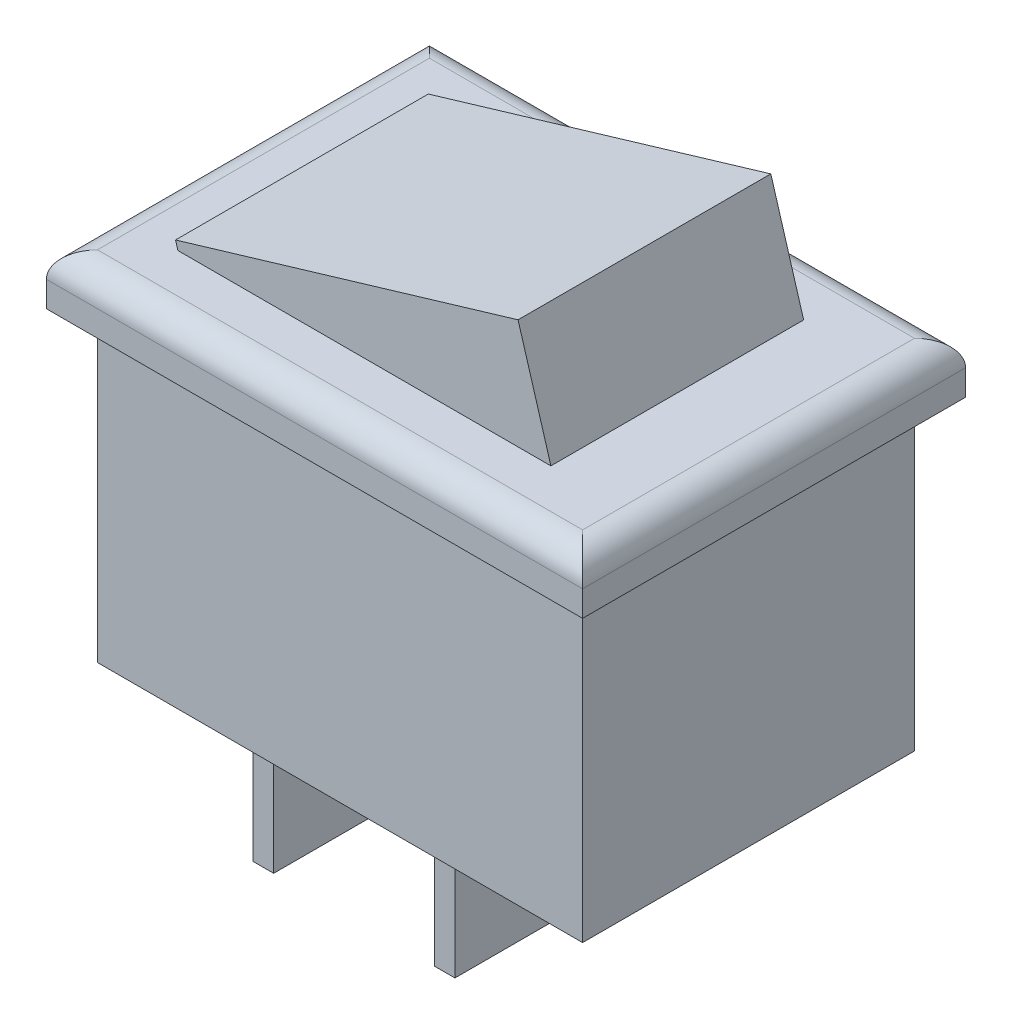
ISO-10303-21;
HEADER;
FILE_DESCRIPTION(('STEP AP214'),'2;1');
FILE_NAME('part.step','',(''),(''),'','','');
FILE_SCHEMA(('AUTOMOTIVE_DESIGN { 1 0 10303 214 1 1 1 1 }'));
ENDSEC;
DATA;
#1=APPLICATION_CONTEXT('core data for automotive mechanical design processes');
#2=APPLICATION_PROTOCOL_DEFINITION('international standard','automotive_design',2000,#1);
#3=PRODUCT_CONTEXT('',#1,'mechanical');
#4=PRODUCT('Part','Part','',(#3));
#5=PRODUCT_RELATED_PRODUCT_CATEGORY('part','',(#4));
#6=PRODUCT_DEFINITION_FORMATION('','',#4);
#7=PRODUCT_DEFINITION_CONTEXT('part definition',#1,'design');
#8=PRODUCT_DEFINITION('design','',#6,#7);
#9=PRODUCT_DEFINITION_SHAPE('','',#8);
#10=(LENGTH_UNIT() NAMED_UNIT(*) SI_UNIT(.MILLI.,.METRE.));
#11=(NAMED_UNIT(*) PLANE_ANGLE_UNIT() SI_UNIT($,.RADIAN.));
#12=(NAMED_UNIT(*) SI_UNIT($,.STERADIAN.) SOLID_ANGLE_UNIT());
#13=UNCERTAINTY_MEASURE_WITH_UNIT(LENGTH_MEASURE(1.E-05),#10,'distance_accuracy_value','');
#14=(GEOMETRIC_REPRESENTATION_CONTEXT(3) GLOBAL_UNCERTAINTY_ASSIGNED_CONTEXT((#13)) GLOBAL_UNIT_ASSIGNED_CONTEXT((#10,
#11,#12)) REPRESENTATION_CONTEXT('',''));
#15=CARTESIAN_POINT('',(0.,0.,0.));
#16=DIRECTION('',(0.,0.,1.));
#17=DIRECTION('',(1.,0.,0.));
#18=AXIS2_PLACEMENT_3D('',#15,#16,#17);
#19=CARTESIAN_POINT('',(0.4,-19.8,2.4));
#20=DIRECTION('',(-1.,0.,0.));
#21=DIRECTION('',(0.,0.,1.));
#22=AXIS2_PLACEMENT_3D('',#19,#20,#21);
#23=PLANE('',#22);
#24=DIRECTION('',(0.,0.,1.));
#25=VECTOR('',#24,1.);
#26=CARTESIAN_POINT('',(0.4,-12.,2.4));
#27=LINE('',#26,#25);
#28=CARTESIAN_POINT('',(0.4,-12.,-2.4));
#29=VERTEX_POINT('',#28);
#30=CARTESIAN_POINT('',(0.4,-12.,2.4));
#31=VERTEX_POINT('',#30);
#32=EDGE_CURVE('E108',#29,#31,#27,.T.);
#33=ORIENTED_EDGE('',*,*,#32,.T.);
#34=DIRECTION('',(0.,1.,0.));
#35=VECTOR('',#34,1.);
#36=CARTESIAN_POINT('',(0.4,-19.8,2.4));
#37=LINE('',#36,#35);
#38=CARTESIAN_POINT('',(0.4,-19.8,2.4));
#39=VERTEX_POINT('',#38);
#40=EDGE_CURVE('E12',#39,#31,#37,.T.);
#41=ORIENTED_EDGE('',*,*,#40,.F.);
#42=DIRECTION('',(0.,0.,1.));
#43=VECTOR('',#42,1.);
#44=CARTESIAN_POINT('',(0.4,-19.8,2.4));
#45=LINE('',#44,#43);
#46=CARTESIAN_POINT('',(0.4,-19.8,-2.4));
#47=VERTEX_POINT('',#46);
#48=EDGE_CURVE('E96',#47,#39,#45,.T.);
#49=ORIENTED_EDGE('',*,*,#48,.F.);
#50=DIRECTION('',(0.,1.,0.));
#51=VECTOR('',#50,1.);
#52=CARTESIAN_POINT('',(0.4,-19.8,-2.4));
#53=LINE('',#52,#51);
#54=EDGE_CURVE('E104',#47,#29,#53,.T.);
#55=ORIENTED_EDGE('',*,*,#54,.T.);
#56=EDGE_LOOP('',(#33,#41,#49,#55));
#57=FACE_BOUND('',#56,.T.);
#58=ADVANCED_FACE('F45',(#57),#23,.F.);
#59=CARTESIAN_POINT('',(0.4,-19.8,2.4));
#60=DIRECTION('',(0.,0.,-1.));
#61=DIRECTION('',(-1.,0.,0.));
#62=AXIS2_PLACEMENT_3D('',#59,#60,#61);
#63=PLANE('',#62);
#64=DIRECTION('',(-1.,0.,0.));
#65=VECTOR('',#64,1.);
#66=CARTESIAN_POINT('',(0.4,-12.,2.4));
#67=LINE('',#66,#65);
#68=CARTESIAN_POINT('',(-0.400000000000001,-12.,2.4));
#69=VERTEX_POINT('',#68);
#70=EDGE_CURVE('E100',#31,#69,#67,.T.);
#71=ORIENTED_EDGE('',*,*,#70,.T.);
#72=DIRECTION('',(0.,1.,0.));
#73=VECTOR('',#72,1.);
#74=CARTESIAN_POINT('',(-0.400000000000001,-19.8,2.4));
#75=LINE('',#74,#73);
#76=CARTESIAN_POINT('',(-0.400000000000001,-19.8,2.4));
#77=VERTEX_POINT('',#76);
#78=EDGE_CURVE('E53',#77,#69,#75,.T.);
#79=ORIENTED_EDGE('',*,*,#78,.F.);
#80=DIRECTION('',(-1.,0.,0.));
#81=VECTOR('',#80,1.);
#82=CARTESIAN_POINT('',(0.4,-19.8,2.4));
#83=LINE('',#82,#81);
#84=EDGE_CURVE('E91',#39,#77,#83,.T.);
#85=ORIENTED_EDGE('',*,*,#84,.F.);
#86=ORIENTED_EDGE('',*,*,#40,.T.);
#87=EDGE_LOOP('',(#71,#79,#85,#86));
#88=FACE_BOUND('',#87,.T.);
#89=ADVANCED_FACE('F99',(#88),#63,.F.);
#90=CARTESIAN_POINT('',(-0.400000000000001,-19.8,2.4));
#91=DIRECTION('',(1.,0.,0.));
#92=DIRECTION('',(0.,0.,-1.));
#93=AXIS2_PLACEMENT_3D('',#90,#91,#92);
#94=PLANE('',#93);
#95=DIRECTION('',(0.,0.,-1.));
#96=VECTOR('',#95,1.);
#97=CARTESIAN_POINT('',(-0.400000000000001,-12.,2.4));
#98=LINE('',#97,#96);
#99=CARTESIAN_POINT('',(-0.400000000000002,-12.,-2.4));
#100=VERTEX_POINT('',#99);
#101=EDGE_CURVE('E78',#69,#100,#98,.T.);
#102=ORIENTED_EDGE('',*,*,#101,.T.);
#103=DIRECTION('',(0.,1.,0.));
#104=VECTOR('',#103,1.);
#105=CARTESIAN_POINT('',(-0.400000000000002,-19.8,-2.4));
#106=LINE('',#105,#104);
#107=CARTESIAN_POINT('',(-0.400000000000002,-19.8,-2.4));
#108=VERTEX_POINT('',#107);
#109=EDGE_CURVE('E101',#108,#100,#106,.T.);
#110=ORIENTED_EDGE('',*,*,#109,.F.);
#111=DIRECTION('',(0.,0.,-1.));
#112=VECTOR('',#111,1.);
#113=CARTESIAN_POINT('',(-0.400000000000001,-19.8,2.4));
#114=LINE('',#113,#112);
#115=EDGE_CURVE('E94',#77,#108,#114,.T.);
#116=ORIENTED_EDGE('',*,*,#115,.F.);
#117=ORIENTED_EDGE('',*,*,#78,.T.);
#118=EDGE_LOOP('',(#102,#110,#116,#117));
#119=FACE_BOUND('',#118,.T.);
#120=ADVANCED_FACE('F102',(#119),#94,.F.);
#121=CARTESIAN_POINT('',(0.4,-19.8,-2.4));
#122=DIRECTION('',(0.,0.,1.));
#123=DIRECTION('',(1.,0.,0.));
#124=AXIS2_PLACEMENT_3D('',#121,#122,#123);
#125=PLANE('',#124);
#126=DIRECTION('',(1.,0.,0.));
#127=VECTOR('',#126,1.);
#128=CARTESIAN_POINT('',(0.4,-12.,-2.4));
#129=LINE('',#128,#127);
#130=EDGE_CURVE('E84',#100,#29,#129,.T.);
#131=ORIENTED_EDGE('',*,*,#130,.T.);
#132=ORIENTED_EDGE('',*,*,#54,.F.);
#133=DIRECTION('',(1.,0.,0.));
#134=VECTOR('',#133,1.);
#135=CARTESIAN_POINT('',(0.4,-19.8,-2.4));
#136=LINE('',#135,#134);
#137=EDGE_CURVE('E61',#108,#47,#136,.T.);
#138=ORIENTED_EDGE('',*,*,#137,.F.);
#139=ORIENTED_EDGE('',*,*,#109,.T.);
#140=EDGE_LOOP('',(#131,#132,#138,#139));
#141=FACE_BOUND('',#140,.T.);
#142=ADVANCED_FACE('F115',(#141),#125,.F.);
#143=CARTESIAN_POINT('',(0.,-19.8,0.));
#144=DIRECTION('',(0.,1.,0.));
#145=DIRECTION('',(0.,0.,1.));
#146=AXIS2_PLACEMENT_3D('',#143,#144,#145);
#147=PLANE('',#146);
#148=ORIENTED_EDGE('',*,*,#48,.T.);
#149=ORIENTED_EDGE('',*,*,#84,.T.);
#150=ORIENTED_EDGE('',*,*,#115,.T.);
#151=ORIENTED_EDGE('',*,*,#137,.T.);
#152=EDGE_LOOP('',(#148,#149,#150,#151));
#153=FACE_BOUND('',#152,.T.);
#154=ADVANCED_FACE('F92',(#153),#147,.F.);
#155=CARTESIAN_POINT('',(0.,-12.,0.));
#156=DIRECTION('',(0.,1.,0.));
#157=DIRECTION('',(0.,0.,1.));
#158=AXIS2_PLACEMENT_3D('',#155,#156,#157);
#159=PLANE('',#158);
#160=ORIENTED_EDGE('',*,*,#32,.F.);
#161=ORIENTED_EDGE('',*,*,#130,.F.);
#162=ORIENTED_EDGE('',*,*,#101,.F.);
#163=ORIENTED_EDGE('',*,*,#70,.F.);
#164=EDGE_LOOP('',(#160,#161,#162,#163));
#165=FACE_BOUND('',#164,.T.);
#166=ADVANCED_FACE('F118',(#165),#159,.T.);
#167=CLOSED_SHELL('',(#58,#89,#120,#142,#154,#166));
#168=MANIFOLD_SOLID_BREP('B2',#167);
#169=CARTESIAN_POINT('',(-7.5,-19.8,2.4));
#170=DIRECTION('',(1.,0.,0.));
#171=DIRECTION('',(0.,0.,-1.));
#172=AXIS2_PLACEMENT_3D('',#169,#170,#171);
#173=PLANE('',#172);
#174=DIRECTION('',(0.,0.,-1.));
#175=VECTOR('',#174,1.);
#176=CARTESIAN_POINT('',(-7.5,-12.,2.4));
#177=LINE('',#176,#175);
#178=CARTESIAN_POINT('',(-7.5,-12.,2.4));
#179=VERTEX_POINT('',#178);
#180=CARTESIAN_POINT('',(-7.5,-12.,-2.4));
#181=VERTEX_POINT('',#180);
#182=EDGE_CURVE('E240',#179,#181,#177,.T.);
#183=ORIENTED_EDGE('',*,*,#182,.T.);
#184=DIRECTION('',(0.,1.,0.));
#185=VECTOR('',#184,1.);
#186=CARTESIAN_POINT('',(-7.5,-19.8,-2.4));
#187=LINE('',#186,#185);
#188=CARTESIAN_POINT('',(-7.5,-19.8,-2.4));
#189=VERTEX_POINT('',#188);
#190=EDGE_CURVE('E43',#189,#181,#187,.T.);
#191=ORIENTED_EDGE('',*,*,#190,.F.);
#192=DIRECTION('',(0.,0.,-1.));
#193=VECTOR('',#192,1.);
#194=CARTESIAN_POINT('',(-7.5,-19.8,2.4));
#195=LINE('',#194,#193);
#196=CARTESIAN_POINT('',(-7.5,-19.8,2.4));
#197=VERTEX_POINT('',#196);
#198=EDGE_CURVE('E228',#197,#189,#195,.T.);
#199=ORIENTED_EDGE('',*,*,#198,.F.);
#200=DIRECTION('',(0.,1.,0.));
#201=VECTOR('',#200,1.);
#202=CARTESIAN_POINT('',(-7.5,-19.8,2.4));
#203=LINE('',#202,#201);
#204=EDGE_CURVE('E236',#197,#179,#203,.T.);
#205=ORIENTED_EDGE('',*,*,#204,.T.);
#206=EDGE_LOOP('',(#183,#191,#199,#205));
#207=FACE_BOUND('',#206,.T.);
#208=ADVANCED_FACE('F177',(#207),#173,.F.);
#209=CARTESIAN_POINT('',(-7.5,-19.8,-2.4));
#210=DIRECTION('',(0.,0.,1.));
#211=DIRECTION('',(1.,0.,0.));
#212=AXIS2_PLACEMENT_3D('',#209,#210,#211);
#213=PLANE('',#212);
#214=DIRECTION('',(1.,0.,0.));
#215=VECTOR('',#214,1.);
#216=CARTESIAN_POINT('',(-7.5,-12.,-2.4));
#217=LINE('',#216,#215);
#218=CARTESIAN_POINT('',(-6.7,-12.,-2.4));
#219=VERTEX_POINT('',#218);
#220=EDGE_CURVE('E232',#181,#219,#217,.T.);
#221=ORIENTED_EDGE('',*,*,#220,.T.);
#222=DIRECTION('',(0.,1.,0.));
#223=VECTOR('',#222,1.);
#224=CARTESIAN_POINT('',(-6.7,-19.8,-2.4));
#225=LINE('',#224,#223);
#226=CARTESIAN_POINT('',(-6.7,-19.8,-2.4));
#227=VERTEX_POINT('',#226);
#228=EDGE_CURVE('E185',#227,#219,#225,.T.);
#229=ORIENTED_EDGE('',*,*,#228,.F.);
#230=DIRECTION('',(1.,0.,0.));
#231=VECTOR('',#230,1.);
#232=CARTESIAN_POINT('',(-7.5,-19.8,-2.4));
#233=LINE('',#232,#231);
#234=EDGE_CURVE('E223',#189,#227,#233,.T.);
#235=ORIENTED_EDGE('',*,*,#234,.F.);
#236=ORIENTED_EDGE('',*,*,#190,.T.);
#237=EDGE_LOOP('',(#221,#229,#235,#236));
#238=FACE_BOUND('',#237,.T.);
#239=ADVANCED_FACE('F231',(#238),#213,.F.);
#240=CARTESIAN_POINT('',(-6.7,-19.8,2.4));
#241=DIRECTION('',(-1.,0.,0.));
#242=DIRECTION('',(0.,0.,1.));
#243=AXIS2_PLACEMENT_3D('',#240,#241,#242);
#244=PLANE('',#243);
#245=DIRECTION('',(0.,0.,1.));
#246=VECTOR('',#245,1.);
#247=CARTESIAN_POINT('',(-6.7,-12.,2.4));
#248=LINE('',#247,#246);
#249=CARTESIAN_POINT('',(-6.7,-12.,2.4));
#250=VERTEX_POINT('',#249);
#251=EDGE_CURVE('E210',#219,#250,#248,.T.);
#252=ORIENTED_EDGE('',*,*,#251,.T.);
#253=DIRECTION('',(0.,1.,0.));
#254=VECTOR('',#253,1.);
#255=CARTESIAN_POINT('',(-6.7,-19.8,2.4));
#256=LINE('',#255,#254);
#257=CARTESIAN_POINT('',(-6.7,-19.8,2.4));
#258=VERTEX_POINT('',#257);
#259=EDGE_CURVE('E233',#258,#250,#256,.T.);
#260=ORIENTED_EDGE('',*,*,#259,.F.);
#261=DIRECTION('',(0.,0.,1.));
#262=VECTOR('',#261,1.);
#263=CARTESIAN_POINT('',(-6.7,-19.8,2.4));
#264=LINE('',#263,#262);
#265=EDGE_CURVE('E226',#227,#258,#264,.T.);
#266=ORIENTED_EDGE('',*,*,#265,.F.);
#267=ORIENTED_EDGE('',*,*,#228,.T.);
#268=EDGE_LOOP('',(#252,#260,#266,#267));
#269=FACE_BOUND('',#268,.T.);
#270=ADVANCED_FACE('F234',(#269),#244,.F.);
#271=CARTESIAN_POINT('',(-7.5,-19.8,2.4));
#272=DIRECTION('',(0.,0.,-1.));
#273=DIRECTION('',(-1.,0.,0.));
#274=AXIS2_PLACEMENT_3D('',#271,#272,#273);
#275=PLANE('',#274);
#276=DIRECTION('',(-1.,0.,0.));
#277=VECTOR('',#276,1.);
#278=CARTESIAN_POINT('',(-7.5,-12.,2.4));
#279=LINE('',#278,#277);
#280=EDGE_CURVE('E216',#250,#179,#279,.T.);
#281=ORIENTED_EDGE('',*,*,#280,.T.);
#282=ORIENTED_EDGE('',*,*,#204,.F.);
#283=DIRECTION('',(-1.,0.,0.));
#284=VECTOR('',#283,1.);
#285=CARTESIAN_POINT('',(-7.5,-19.8,2.4));
#286=LINE('',#285,#284);
#287=EDGE_CURVE('E193',#258,#197,#286,.T.);
#288=ORIENTED_EDGE('',*,*,#287,.F.);
#289=ORIENTED_EDGE('',*,*,#259,.T.);
#290=EDGE_LOOP('',(#281,#282,#288,#289));
#291=FACE_BOUND('',#290,.T.);
#292=ADVANCED_FACE('F247',(#291),#275,.F.);
#293=CARTESIAN_POINT('',(0.,-19.8,0.));
#294=DIRECTION('',(0.,-1.,0.));
#295=DIRECTION('',(0.,0.,-1.));
#296=AXIS2_PLACEMENT_3D('',#293,#294,#295);
#297=PLANE('',#296);
#298=ORIENTED_EDGE('',*,*,#198,.T.);
#299=ORIENTED_EDGE('',*,*,#234,.T.);
#300=ORIENTED_EDGE('',*,*,#265,.T.);
#301=ORIENTED_EDGE('',*,*,#287,.T.);
#302=EDGE_LOOP('',(#298,#299,#300,#301));
#303=FACE_BOUND('',#302,.T.);
#304=ADVANCED_FACE('F224',(#303),#297,.T.);
#305=CARTESIAN_POINT('',(0.,-12.,0.));
#306=DIRECTION('',(0.,-1.,0.));
#307=DIRECTION('',(0.,0.,-1.));
#308=AXIS2_PLACEMENT_3D('',#305,#306,#307);
#309=PLANE('',#308);
#310=ORIENTED_EDGE('',*,*,#182,.F.);
#311=ORIENTED_EDGE('',*,*,#280,.F.);
#312=ORIENTED_EDGE('',*,*,#251,.F.);
#313=ORIENTED_EDGE('',*,*,#220,.F.);
#314=EDGE_LOOP('',(#310,#311,#312,#313));
#315=FACE_BOUND('',#314,.T.);
#316=ADVANCED_FACE('F250',(#315),#309,.F.);
#317=CLOSED_SHELL('',(#208,#239,#270,#292,#304,#316));
#318=MANIFOLD_SOLID_BREP('B6',#317);
#319=CARTESIAN_POINT('',(0.,2.,0.));
#320=DIRECTION('',(0.,-1.,0.));
#321=DIRECTION('',(0.,0.,-1.));
#322=AXIS2_PLACEMENT_3D('',#319,#320,#321);
#323=PLANE('',#322);
#324=DIRECTION('',(0.,0.,1.));
#325=VECTOR('',#324,1.);
#326=CARTESIAN_POINT('',(-9.5,2.,0.));
#327=LINE('',#326,#325);
#328=CARTESIAN_POINT('',(-9.5,2.,-6.5));
#329=VERTEX_POINT('',#328);
#330=CARTESIAN_POINT('',(-9.5,2.,6.5));
#331=VERTEX_POINT('',#330);
#332=EDGE_CURVE('E493',#329,#331,#327,.T.);
#333=ORIENTED_EDGE('',*,*,#332,.T.);
#334=DIRECTION('',(1.,0.,0.));
#335=VECTOR('',#334,1.);
#336=CARTESIAN_POINT('',(0.,2.,6.5));
#337=LINE('',#336,#335);
#338=CARTESIAN_POINT('',(9.5,2.,6.5));
#339=VERTEX_POINT('',#338);
#340=EDGE_CURVE('E495',#331,#339,#337,.T.);
#341=ORIENTED_EDGE('',*,*,#340,.T.);
#342=DIRECTION('',(0.,0.,-1.));
#343=VECTOR('',#342,1.);
#344=CARTESIAN_POINT('',(9.5,2.,0.));
#345=LINE('',#344,#343);
#346=CARTESIAN_POINT('',(9.5,2.,-6.5));
#347=VERTEX_POINT('',#346);
#348=EDGE_CURVE('E489',#339,#347,#345,.T.);
#349=ORIENTED_EDGE('',*,*,#348,.T.);
#350=DIRECTION('',(-1.,0.,0.));
#351=VECTOR('',#350,1.);
#352=CARTESIAN_POINT('',(0.,2.,-6.5));
#353=LINE('',#352,#351);
#354=EDGE_CURVE('E491',#347,#329,#353,.T.);
#355=ORIENTED_EDGE('',*,*,#354,.T.);
#356=EDGE_LOOP('',(#333,#341,#349,#355));
#357=FACE_BOUND('',#356,.T.);
#358=DIRECTION('',(1.,0.,0.));
#359=VECTOR('',#358,1.);
#360=CARTESIAN_POINT('',(0.,2.,4.95));
#361=LINE('',#360,#359);
#362=CARTESIAN_POINT('',(-7.90077352049926,2.,4.95));
#363=VERTEX_POINT('',#362);
#364=CARTESIAN_POINT('',(6.70820393249937,2.,4.95));
#365=VERTEX_POINT('',#364);
#366=EDGE_CURVE('E175',#363,#365,#361,.T.);
#367=ORIENTED_EDGE('',*,*,#366,.F.);
#368=DIRECTION('',(0.,0.,1.));
#369=VECTOR('',#368,1.);
#370=CARTESIAN_POINT('',(-7.90077352049926,2.,0.));
#371=LINE('',#370,#369);
#372=CARTESIAN_POINT('',(-7.90077352049926,2.,-4.95));
#373=VERTEX_POINT('',#372);
#374=EDGE_CURVE('E308',#373,#363,#371,.T.);
#375=ORIENTED_EDGE('',*,*,#374,.F.);
#376=DIRECTION('',(1.,0.,0.));
#377=VECTOR('',#376,1.);
#378=CARTESIAN_POINT('',(0.,2.,-4.95));
#379=LINE('',#378,#377);
#380=CARTESIAN_POINT('',(6.70820393249937,2.,-4.95));
#381=VERTEX_POINT('',#380);
#382=EDGE_CURVE('E505',#373,#381,#379,.T.);
#383=ORIENTED_EDGE('',*,*,#382,.T.);
#384=DIRECTION('',(0.,0.,-1.));
#385=VECTOR('',#384,1.);
#386=CARTESIAN_POINT('',(6.70820393249937,2.,4.95));
#387=LINE('',#386,#385);
#388=EDGE_CURVE('E424',#365,#381,#387,.T.);
#389=ORIENTED_EDGE('',*,*,#388,.F.);
#390=EDGE_LOOP('',(#367,#375,#383,#389));
#391=FACE_BOUND('',#390,.T.);
#392=ADVANCED_FACE('F300',(#357,#391),#323,.F.);
#393=CARTESIAN_POINT('',(10.5,2.,7.5));
#394=DIRECTION('',(-1.,0.,0.));
#395=DIRECTION('',(0.,0.,1.));
#396=AXIS2_PLACEMENT_3D('',#393,#394,#395);
#397=PLANE('',#396);
#398=DIRECTION('',(0.,-1.,0.));
#399=VECTOR('',#398,1.);
#400=CARTESIAN_POINT('',(10.5,2.,-7.5));
#401=LINE('',#400,#399);
#402=CARTESIAN_POINT('',(10.5,1.,-7.5));
#403=VERTEX_POINT('',#402);
#404=CARTESIAN_POINT('',(10.5,0.,-7.5));
#405=VERTEX_POINT('',#404);
#406=EDGE_CURVE('E475',#403,#405,#401,.T.);
#407=ORIENTED_EDGE('',*,*,#406,.F.);
#408=DIRECTION('',(0.,0.,-1.));
#409=VECTOR('',#408,1.);
#410=CARTESIAN_POINT('',(10.5,1.,7.5));
#411=LINE('',#410,#409);
#412=CARTESIAN_POINT('',(10.5,1.,7.5));
#413=VERTEX_POINT('',#412);
#414=EDGE_CURVE('E504',#403,#413,#411,.F.);
#415=ORIENTED_EDGE('',*,*,#414,.T.);
#416=DIRECTION('',(0.,-1.,0.));
#417=VECTOR('',#416,1.);
#418=CARTESIAN_POINT('',(10.5,2.,7.5));
#419=LINE('',#418,#417);
#420=CARTESIAN_POINT('',(10.5,0.,7.5));
#421=VERTEX_POINT('',#420);
#422=EDGE_CURVE('E469',#413,#421,#419,.T.);
#423=ORIENTED_EDGE('',*,*,#422,.T.);
#424=DIRECTION('',(0.,0.,-1.));
#425=VECTOR('',#424,1.);
#426=CARTESIAN_POINT('',(10.5,0.,7.5));
#427=LINE('',#426,#425);
#428=EDGE_CURVE('E449',#421,#405,#427,.T.);
#429=ORIENTED_EDGE('',*,*,#428,.T.);
#430=EDGE_LOOP('',(#407,#415,#423,#429));
#431=FACE_BOUND('',#430,.T.);
#432=ADVANCED_FACE('F533',(#431),#397,.F.);
#433=CARTESIAN_POINT('',(-10.5,2.,-7.5));
#434=DIRECTION('',(0.,0.,1.));
#435=DIRECTION('',(1.,0.,0.));
#436=AXIS2_PLACEMENT_3D('',#433,#434,#435);
#437=PLANE('',#436);
#438=DIRECTION('',(0.,-1.,0.));
#439=VECTOR('',#438,1.);
#440=CARTESIAN_POINT('',(-10.5,2.,-7.5));
#441=LINE('',#440,#439);
#442=CARTESIAN_POINT('',(-10.5,1.,-7.5));
#443=VERTEX_POINT('',#442);
#444=CARTESIAN_POINT('',(-10.5,0.,-7.5));
#445=VERTEX_POINT('',#444);
#446=EDGE_CURVE('E473',#443,#445,#441,.T.);
#447=ORIENTED_EDGE('',*,*,#446,.F.);
#448=DIRECTION('',(-1.,0.,0.));
#449=VECTOR('',#448,1.);
#450=CARTESIAN_POINT('',(-10.5,1.,-7.5));
#451=LINE('',#450,#449);
#452=EDGE_CURVE('E323',#443,#403,#451,.F.);
#453=ORIENTED_EDGE('',*,*,#452,.T.);
#454=ORIENTED_EDGE('',*,*,#406,.T.);
#455=DIRECTION('',(-1.,0.,0.));
#456=VECTOR('',#455,1.);
#457=CARTESIAN_POINT('',(-10.5,0.,-7.5));
#458=LINE('',#457,#456);
#459=EDGE_CURVE('E460',#405,#445,#458,.T.);
#460=ORIENTED_EDGE('',*,*,#459,.T.);
#461=EDGE_LOOP('',(#447,#453,#454,#460));
#462=FACE_BOUND('',#461,.T.);
#463=ADVANCED_FACE('F539',(#462),#437,.F.);
#464=CARTESIAN_POINT('',(-10.5,2.,7.5));
#465=DIRECTION('',(1.,0.,0.));
#466=DIRECTION('',(0.,0.,-1.));
#467=AXIS2_PLACEMENT_3D('',#464,#465,#466);
#468=PLANE('',#467);
#469=DIRECTION('',(0.,-1.,0.));
#470=VECTOR('',#469,1.);
#471=CARTESIAN_POINT('',(-10.5,2.,7.5));
#472=LINE('',#471,#470);
#473=CARTESIAN_POINT('',(-10.5,1.,7.5));
#474=VERTEX_POINT('',#473);
#475=CARTESIAN_POINT('',(-10.5,0.,7.5));
#476=VERTEX_POINT('',#475);
#477=EDGE_CURVE('E471',#474,#476,#472,.T.);
#478=ORIENTED_EDGE('',*,*,#477,.F.);
#479=DIRECTION('',(0.,0.,1.));
#480=VECTOR('',#479,1.);
#481=CARTESIAN_POINT('',(-10.5,1.,7.5));
#482=LINE('',#481,#480);
#483=EDGE_CURVE('E501',#474,#443,#482,.F.);
#484=ORIENTED_EDGE('',*,*,#483,.T.);
#485=ORIENTED_EDGE('',*,*,#446,.T.);
#486=DIRECTION('',(0.,0.,1.));
#487=VECTOR('',#486,1.);
#488=CARTESIAN_POINT('',(-10.5,0.,7.5));
#489=LINE('',#488,#487);
#490=EDGE_CURVE('E463',#445,#476,#489,.T.);
#491=ORIENTED_EDGE('',*,*,#490,.T.);
#492=EDGE_LOOP('',(#478,#484,#485,#491));
#493=FACE_BOUND('',#492,.T.);
#494=ADVANCED_FACE('F553',(#493),#468,.F.);
#495=CARTESIAN_POINT('',(-10.5,2.,7.5));
#496=DIRECTION('',(0.,0.,-1.));
#497=DIRECTION('',(-1.,0.,0.));
#498=AXIS2_PLACEMENT_3D('',#495,#496,#497);
#499=PLANE('',#498);
#500=ORIENTED_EDGE('',*,*,#422,.F.);
#501=DIRECTION('',(1.,0.,0.));
#502=VECTOR('',#501,1.);
#503=CARTESIAN_POINT('',(-10.5,1.,7.5));
#504=LINE('',#503,#502);
#505=EDGE_CURVE('E498',#413,#474,#504,.F.);
#506=ORIENTED_EDGE('',*,*,#505,.T.);
#507=ORIENTED_EDGE('',*,*,#477,.T.);
#508=DIRECTION('',(1.,0.,0.));
#509=VECTOR('',#508,1.);
#510=CARTESIAN_POINT('',(-10.5,0.,7.5));
#511=LINE('',#510,#509);
#512=EDGE_CURVE('E466',#476,#421,#511,.T.);
#513=ORIENTED_EDGE('',*,*,#512,.T.);
#514=EDGE_LOOP('',(#500,#506,#507,#513));
#515=FACE_BOUND('',#514,.T.);
#516=ADVANCED_FACE('F549',(#515),#499,.F.);
#517=CARTESIAN_POINT('',(0.,0.,0.));
#518=DIRECTION('',(0.,-1.,0.));
#519=DIRECTION('',(0.,0.,-1.));
#520=AXIS2_PLACEMENT_3D('',#517,#518,#519);
#521=PLANE('',#520);
#522=DIRECTION('',(0.,0.,1.));
#523=VECTOR('',#522,1.);
#524=CARTESIAN_POINT('',(9.5,0.,0.));
#525=LINE('',#524,#523);
#526=CARTESIAN_POINT('',(9.5,0.,-6.5));
#527=VERTEX_POINT('',#526);
#528=CARTESIAN_POINT('',(9.5,0.,6.5));
#529=VERTEX_POINT('',#528);
#530=EDGE_CURVE('E486',#527,#529,#525,.T.);
#531=ORIENTED_EDGE('',*,*,#530,.F.);
#532=DIRECTION('',(1.,0.,0.));
#533=VECTOR('',#532,1.);
#534=CARTESIAN_POINT('',(0.,0.,-6.5));
#535=LINE('',#534,#533);
#536=CARTESIAN_POINT('',(-9.5,0.,-6.5));
#537=VERTEX_POINT('',#536);
#538=EDGE_CURVE('E477',#537,#527,#535,.T.);
#539=ORIENTED_EDGE('',*,*,#538,.F.);
#540=DIRECTION('',(0.,0.,-1.));
#541=VECTOR('',#540,1.);
#542=CARTESIAN_POINT('',(-9.5,0.,0.));
#543=LINE('',#542,#541);
#544=CARTESIAN_POINT('',(-9.5,0.,6.5));
#545=VERTEX_POINT('',#544);
#546=EDGE_CURVE('E480',#545,#537,#543,.T.);
#547=ORIENTED_EDGE('',*,*,#546,.F.);
#548=DIRECTION('',(-1.,0.,0.));
#549=VECTOR('',#548,1.);
#550=CARTESIAN_POINT('',(0.,0.,6.5));
#551=LINE('',#550,#549);
#552=EDGE_CURVE('E483',#529,#545,#551,.T.);
#553=ORIENTED_EDGE('',*,*,#552,.F.);
#554=EDGE_LOOP('',(#531,#539,#547,#553));
#555=FACE_BOUND('',#554,.T.);
#556=ORIENTED_EDGE('',*,*,#428,.F.);
#557=ORIENTED_EDGE('',*,*,#512,.F.);
#558=ORIENTED_EDGE('',*,*,#490,.F.);
#559=ORIENTED_EDGE('',*,*,#459,.F.);
#560=EDGE_LOOP('',(#556,#557,#558,#559));
#561=FACE_BOUND('',#560,.T.);
#562=ADVANCED_FACE('F546',(#555,#561),#521,.T.);
#563=CARTESIAN_POINT('',(9.5,-12.,6.5));
#564=DIRECTION('',(1.,0.,0.));
#565=DIRECTION('',(0.,0.,-1.));
#566=AXIS2_PLACEMENT_3D('',#563,#564,#565);
#567=PLANE('',#566);
#568=DIRECTION('',(0.,1.,0.));
#569=VECTOR('',#568,1.);
#570=CARTESIAN_POINT('',(9.5,-12.,-6.5));
#571=LINE('',#570,#569);
#572=CARTESIAN_POINT('',(9.5,-12.,-6.5));
#573=VERTEX_POINT('',#572);
#574=EDGE_CURVE('E445',#573,#527,#571,.T.);
#575=ORIENTED_EDGE('',*,*,#574,.T.);
#576=ORIENTED_EDGE('',*,*,#530,.T.);
#577=DIRECTION('',(0.,1.,0.));
#578=VECTOR('',#577,1.);
#579=CARTESIAN_POINT('',(9.5,-12.,6.5));
#580=LINE('',#579,#578);
#581=CARTESIAN_POINT('',(9.5,-12.,6.5));
#582=VERTEX_POINT('',#581);
#583=EDGE_CURVE('E446',#582,#529,#580,.T.);
#584=ORIENTED_EDGE('',*,*,#583,.F.);
#585=DIRECTION('',(0.,0.,-1.));
#586=VECTOR('',#585,1.);
#587=CARTESIAN_POINT('',(9.5,-12.,6.5));
#588=LINE('',#587,#586);
#589=EDGE_CURVE('E432',#582,#573,#588,.T.);
#590=ORIENTED_EDGE('',*,*,#589,.T.);
#591=EDGE_LOOP('',(#575,#576,#584,#590));
#592=FACE_BOUND('',#591,.T.);
#593=ADVANCED_FACE('F544',(#592),#567,.T.);
#594=CARTESIAN_POINT('',(-9.5,-12.,6.5));
#595=DIRECTION('',(0.,0.,1.));
#596=DIRECTION('',(1.,0.,0.));
#597=AXIS2_PLACEMENT_3D('',#594,#595,#596);
#598=PLANE('',#597);
#599=ORIENTED_EDGE('',*,*,#583,.T.);
#600=ORIENTED_EDGE('',*,*,#552,.T.);
#601=DIRECTION('',(0.,1.,0.));
#602=VECTOR('',#601,1.);
#603=CARTESIAN_POINT('',(-9.5,-12.,6.5));
#604=LINE('',#603,#602);
#605=CARTESIAN_POINT('',(-9.5,-12.,6.5));
#606=VERTEX_POINT('',#605);
#607=EDGE_CURVE('E450',#606,#545,#604,.T.);
#608=ORIENTED_EDGE('',*,*,#607,.F.);
#609=DIRECTION('',(1.,0.,0.));
#610=VECTOR('',#609,1.);
#611=CARTESIAN_POINT('',(-9.5,-12.,6.5));
#612=LINE('',#611,#610);
#613=EDGE_CURVE('E442',#606,#582,#612,.T.);
#614=ORIENTED_EDGE('',*,*,#613,.T.);
#615=EDGE_LOOP('',(#599,#600,#608,#614));
#616=FACE_BOUND('',#615,.T.);
#617=ADVANCED_FACE('F606',(#616),#598,.T.);
#618=CARTESIAN_POINT('',(-9.5,-12.,6.5));
#619=DIRECTION('',(-1.,0.,0.));
#620=DIRECTION('',(0.,0.,1.));
#621=AXIS2_PLACEMENT_3D('',#618,#619,#620);
#622=PLANE('',#621);
#623=ORIENTED_EDGE('',*,*,#607,.T.);
#624=ORIENTED_EDGE('',*,*,#546,.T.);
#625=DIRECTION('',(0.,1.,0.));
#626=VECTOR('',#625,1.);
#627=CARTESIAN_POINT('',(-9.5,-12.,-6.5));
#628=LINE('',#627,#626);
#629=CARTESIAN_POINT('',(-9.5,-12.,-6.5));
#630=VERTEX_POINT('',#629);
#631=EDGE_CURVE('E453',#630,#537,#628,.T.);
#632=ORIENTED_EDGE('',*,*,#631,.F.);
#633=DIRECTION('',(0.,0.,1.));
#634=VECTOR('',#633,1.);
#635=CARTESIAN_POINT('',(-9.5,-12.,6.5));
#636=LINE('',#635,#634);
#637=EDGE_CURVE('E439',#630,#606,#636,.T.);
#638=ORIENTED_EDGE('',*,*,#637,.T.);
#639=EDGE_LOOP('',(#623,#624,#632,#638));
#640=FACE_BOUND('',#639,.T.);
#641=ADVANCED_FACE('F602',(#640),#622,.T.);
#642=CARTESIAN_POINT('',(-9.5,-12.,-6.5));
#643=DIRECTION('',(0.,0.,-1.));
#644=DIRECTION('',(-1.,0.,0.));
#645=AXIS2_PLACEMENT_3D('',#642,#643,#644);
#646=PLANE('',#645);
#647=ORIENTED_EDGE('',*,*,#631,.T.);
#648=ORIENTED_EDGE('',*,*,#538,.T.);
#649=ORIENTED_EDGE('',*,*,#574,.F.);
#650=DIRECTION('',(-1.,0.,0.));
#651=VECTOR('',#650,1.);
#652=CARTESIAN_POINT('',(-9.5,-12.,-6.5));
#653=LINE('',#652,#651);
#654=EDGE_CURVE('E435',#573,#630,#653,.T.);
#655=ORIENTED_EDGE('',*,*,#654,.T.);
#656=EDGE_LOOP('',(#647,#648,#649,#655));
#657=FACE_BOUND('',#656,.T.);
#658=ADVANCED_FACE('F596',(#657),#646,.T.);
#659=CARTESIAN_POINT('',(0.,-12.,0.));
#660=DIRECTION('',(0.,-1.,0.));
#661=DIRECTION('',(0.,0.,-1.));
#662=AXIS2_PLACEMENT_3D('',#659,#660,#661);
#663=PLANE('',#662);
#664=ORIENTED_EDGE('',*,*,#589,.F.);
#665=ORIENTED_EDGE('',*,*,#613,.F.);
#666=ORIENTED_EDGE('',*,*,#637,.F.);
#667=ORIENTED_EDGE('',*,*,#654,.F.);
#668=EDGE_LOOP('',(#664,#665,#666,#667));
#669=FACE_BOUND('',#668,.T.);
#670=ADVANCED_FACE('F573',(#669),#663,.T.);
#671=CARTESIAN_POINT('',(0.,1.,-6.5));
#672=DIRECTION('',(-1.,0.,0.));
#673=DIRECTION('',(0.,0.,1.));
#674=AXIS2_PLACEMENT_3D('',#671,#672,#673);
#675=CYLINDRICAL_SURFACE('',#674,1.);
#676=CARTESIAN_POINT('',(9.5,1.,-6.5));
#677=DIRECTION('',(-0.707106781186547,0.,-0.707106781186547));
#678=DIRECTION('',(0.707106781186547,0.,-0.707106781186547));
#679=AXIS2_PLACEMENT_3D('',#676,#677,#678);
#680=ELLIPSE('',#679,1.41421356237309,1.);
#681=EDGE_CURVE('E508',#403,#347,#680,.F.);
#682=ORIENTED_EDGE('',*,*,#681,.F.);
#683=ORIENTED_EDGE('',*,*,#452,.F.);
#684=CARTESIAN_POINT('',(-9.5,1.,-6.5));
#685=DIRECTION('',(-0.707106781186547,0.,0.707106781186547));
#686=DIRECTION('',(-0.707106781186547,0.,-0.707106781186547));
#687=AXIS2_PLACEMENT_3D('',#684,#685,#686);
#688=ELLIPSE('',#687,1.41421356237309,1.);
#689=EDGE_CURVE('E436',#329,#443,#688,.T.);
#690=ORIENTED_EDGE('',*,*,#689,.F.);
#691=ORIENTED_EDGE('',*,*,#354,.F.);
#692=EDGE_LOOP('',(#682,#683,#690,#691));
#693=FACE_BOUND('',#692,.T.);
#694=ADVANCED_FACE('F302',(#693),#675,.T.);
#695=CARTESIAN_POINT('',(-9.5,1.,0.));
#696=DIRECTION('',(0.,0.,1.));
#697=DIRECTION('',(1.,0.,0.));
#698=AXIS2_PLACEMENT_3D('',#695,#696,#697);
#699=CYLINDRICAL_SURFACE('',#698,1.);
#700=ORIENTED_EDGE('',*,*,#689,.T.);
#701=ORIENTED_EDGE('',*,*,#483,.F.);
#702=CARTESIAN_POINT('',(-9.5,1.,6.5));
#703=DIRECTION('',(0.707106781186547,0.,0.707106781186547));
#704=DIRECTION('',(-0.707106781186547,0.,0.707106781186547));
#705=AXIS2_PLACEMENT_3D('',#702,#703,#704);
#706=ELLIPSE('',#705,1.41421356237309,1.);
#707=EDGE_CURVE('E426',#331,#474,#706,.T.);
#708=ORIENTED_EDGE('',*,*,#707,.F.);
#709=ORIENTED_EDGE('',*,*,#332,.F.);
#710=EDGE_LOOP('',(#700,#701,#708,#709));
#711=FACE_BOUND('',#710,.T.);
#712=ADVANCED_FACE('F566',(#711),#699,.T.);
#713=CARTESIAN_POINT('',(9.5,1.,0.));
#714=DIRECTION('',(0.,0.,-1.));
#715=DIRECTION('',(-1.,0.,0.));
#716=AXIS2_PLACEMENT_3D('',#713,#714,#715);
#717=CYLINDRICAL_SURFACE('',#716,1.);
#718=ORIENTED_EDGE('',*,*,#681,.T.);
#719=ORIENTED_EDGE('',*,*,#348,.F.);
#720=CARTESIAN_POINT('',(9.5,1.,6.5));
#721=DIRECTION('',(0.707106781186547,0.,-0.707106781186547));
#722=DIRECTION('',(-0.707106781186547,0.,-0.707106781186547));
#723=AXIS2_PLACEMENT_3D('',#720,#721,#722);
#724=ELLIPSE('',#723,1.41421356237309,1.);
#725=EDGE_CURVE('E423',#413,#339,#724,.F.);
#726=ORIENTED_EDGE('',*,*,#725,.F.);
#727=ORIENTED_EDGE('',*,*,#414,.F.);
#728=EDGE_LOOP('',(#718,#719,#726,#727));
#729=FACE_BOUND('',#728,.T.);
#730=ADVANCED_FACE('F563',(#729),#717,.T.);
#731=CARTESIAN_POINT('',(0.,1.,6.5));
#732=DIRECTION('',(1.,0.,0.));
#733=DIRECTION('',(0.,0.,-1.));
#734=AXIS2_PLACEMENT_3D('',#731,#732,#733);
#735=CYLINDRICAL_SURFACE('',#734,1.);
#736=ORIENTED_EDGE('',*,*,#707,.T.);
#737=ORIENTED_EDGE('',*,*,#505,.F.);
#738=ORIENTED_EDGE('',*,*,#725,.T.);
#739=ORIENTED_EDGE('',*,*,#340,.F.);
#740=EDGE_LOOP('',(#736,#737,#738,#739));
#741=FACE_BOUND('',#740,.T.);
#742=ADVANCED_FACE('F560',(#741),#735,.T.);
#743=CARTESIAN_POINT('',(-7.99391821821366,2.31241681374958,4.95));
#744=DIRECTION('',(0.958314847499909,0.285714285714287,0.));
#745=DIRECTION('',(-0.285714285714287,0.958314847499909,0.));
#746=AXIS2_PLACEMENT_3D('',#743,#744,#745);
#747=PLANE('',#746);
#748=DIRECTION('',(0.285714285714287,-0.958314847499909,0.));
#749=VECTOR('',#748,1.);
#750=CARTESIAN_POINT('',(-7.99391821821366,2.31241681374958,-4.95));
#751=LINE('',#750,#749);
#752=CARTESIAN_POINT('',(-7.99391821821366,2.31241681374958,-4.95));
#753=VERTEX_POINT('',#752);
#754=EDGE_CURVE('E517',#753,#373,#751,.T.);
#755=ORIENTED_EDGE('',*,*,#754,.T.);
#756=ORIENTED_EDGE('',*,*,#374,.T.);
#757=DIRECTION('',(0.285714285714287,-0.958314847499909,0.));
#758=VECTOR('',#757,1.);
#759=CARTESIAN_POINT('',(-7.99391821821366,2.31241681374958,4.95));
#760=LINE('',#759,#758);
#761=CARTESIAN_POINT('',(-7.99391821821366,2.31241681374958,4.95));
#762=VERTEX_POINT('',#761);
#763=EDGE_CURVE('E401',#762,#363,#760,.T.);
#764=ORIENTED_EDGE('',*,*,#763,.F.);
#765=DIRECTION('',(0.,0.,-1.));
#766=VECTOR('',#765,1.);
#767=CARTESIAN_POINT('',(-7.99391821821366,2.31241681374958,4.95));
#768=LINE('',#767,#766);
#769=EDGE_CURVE('E406',#762,#753,#768,.T.);
#770=ORIENTED_EDGE('',*,*,#769,.T.);
#771=EDGE_LOOP('',(#755,#756,#764,#770));
#772=FACE_BOUND('',#771,.T.);
#773=ADVANCED_FACE('F404',(#772),#747,.F.);
#774=CARTESIAN_POINT('',(0.,0.,4.95));
#775=DIRECTION('',(0.,0.,-1.));
#776=DIRECTION('',(-1.,0.,0.));
#777=AXIS2_PLACEMENT_3D('',#774,#775,#776);
#778=PLANE('',#777);
#779=ORIENTED_EDGE('',*,*,#763,.T.);
#780=ORIENTED_EDGE('',*,*,#366,.T.);
#781=DIRECTION('',(-0.285714285714286,0.95831484749991,0.));
#782=VECTOR('',#781,1.);
#783=CARTESIAN_POINT('',(5.42248964678508,6.31241681374961,4.95));
#784=LINE('',#783,#782);
#785=CARTESIAN_POINT('',(5.42248964678508,6.31241681374961,4.95));
#786=VERTEX_POINT('',#785);
#787=EDGE_CURVE('E411',#365,#786,#784,.T.);
#788=ORIENTED_EDGE('',*,*,#787,.T.);
#789=DIRECTION('',(-0.958314847499909,-0.285714285714288,0.));
#790=VECTOR('',#789,1.);
#791=CARTESIAN_POINT('',(-7.99391821821366,2.31241681374958,4.95));
#792=LINE('',#791,#790);
#793=EDGE_CURVE('E412',#786,#762,#792,.T.);
#794=ORIENTED_EDGE('',*,*,#793,.T.);
#795=EDGE_LOOP('',(#779,#780,#788,#794));
#796=FACE_BOUND('',#795,.T.);
#797=ADVANCED_FACE('F415',(#796),#778,.F.);
#798=CARTESIAN_POINT('',(0.,0.,-4.95));
#799=DIRECTION('',(0.,0.,-1.));
#800=DIRECTION('',(-1.,0.,0.));
#801=AXIS2_PLACEMENT_3D('',#798,#799,#800);
#802=PLANE('',#801);
#803=ORIENTED_EDGE('',*,*,#382,.F.);
#804=ORIENTED_EDGE('',*,*,#754,.F.);
#805=DIRECTION('',(-0.958314847499909,-0.285714285714288,0.));
#806=VECTOR('',#805,1.);
#807=CARTESIAN_POINT('',(-7.99391821821366,2.31241681374958,-4.95));
#808=LINE('',#807,#806);
#809=CARTESIAN_POINT('',(5.42248964678508,6.31241681374961,-4.95));
#810=VERTEX_POINT('',#809);
#811=EDGE_CURVE('E422',#810,#753,#808,.T.);
#812=ORIENTED_EDGE('',*,*,#811,.F.);
#813=DIRECTION('',(-0.285714285714286,0.95831484749991,0.));
#814=VECTOR('',#813,1.);
#815=CARTESIAN_POINT('',(5.42248964678508,6.31241681374961,-4.95));
#816=LINE('',#815,#814);
#817=EDGE_CURVE('E315',#381,#810,#816,.T.);
#818=ORIENTED_EDGE('',*,*,#817,.F.);
#819=EDGE_LOOP('',(#803,#804,#812,#818));
#820=FACE_BOUND('',#819,.T.);
#821=ADVANCED_FACE('F516',(#820),#802,.T.);
#822=CARTESIAN_POINT('',(-7.99391821821366,2.31241681374958,4.95));
#823=DIRECTION('',(0.285714285714288,-0.958314847499909,0.));
#824=DIRECTION('',(0.958314847499909,0.285714285714288,0.));
#825=AXIS2_PLACEMENT_3D('',#822,#823,#824);
#826=PLANE('',#825);
#827=ORIENTED_EDGE('',*,*,#811,.T.);
#828=ORIENTED_EDGE('',*,*,#769,.F.);
#829=ORIENTED_EDGE('',*,*,#793,.F.);
#830=DIRECTION('',(0.,0.,-1.));
#831=VECTOR('',#830,1.);
#832=CARTESIAN_POINT('',(5.42248964678508,6.31241681374961,4.95));
#833=LINE('',#832,#831);
#834=EDGE_CURVE('E428',#786,#810,#833,.T.);
#835=ORIENTED_EDGE('',*,*,#834,.T.);
#836=EDGE_LOOP('',(#827,#828,#829,#835));
#837=FACE_BOUND('',#836,.T.);
#838=ADVANCED_FACE('F421',(#837),#826,.F.);
#839=CARTESIAN_POINT('',(5.42248964678508,6.31241681374961,4.95));
#840=DIRECTION('',(-0.95831484749991,-0.285714285714286,0.));
#841=DIRECTION('',(0.285714285714286,-0.95831484749991,0.));
#842=AXIS2_PLACEMENT_3D('',#839,#840,#841);
#843=PLANE('',#842);
#844=ORIENTED_EDGE('',*,*,#817,.T.);
#845=ORIENTED_EDGE('',*,*,#834,.F.);
#846=ORIENTED_EDGE('',*,*,#787,.F.);
#847=ORIENTED_EDGE('',*,*,#388,.T.);
#848=EDGE_LOOP('',(#844,#845,#846,#847));
#849=FACE_BOUND('',#848,.T.);
#850=ADVANCED_FACE('F523',(#849),#843,.F.);
#851=CLOSED_SHELL('',(#392,#432,#463,#494,#516,#562,#593,#617,#641,#658,#670,#694,#712,#730,
#742,#773,#797,#821,#838,#850));
#852=MANIFOLD_SOLID_BREP('B37',#851);
#853=ADVANCED_BREP_SHAPE_REPRESENTATION('',(#18,#168,#318,#852),#14);
#854=SHAPE_DEFINITION_REPRESENTATION(#9,#853);
ENDSEC;
END-ISO-10303-21;
